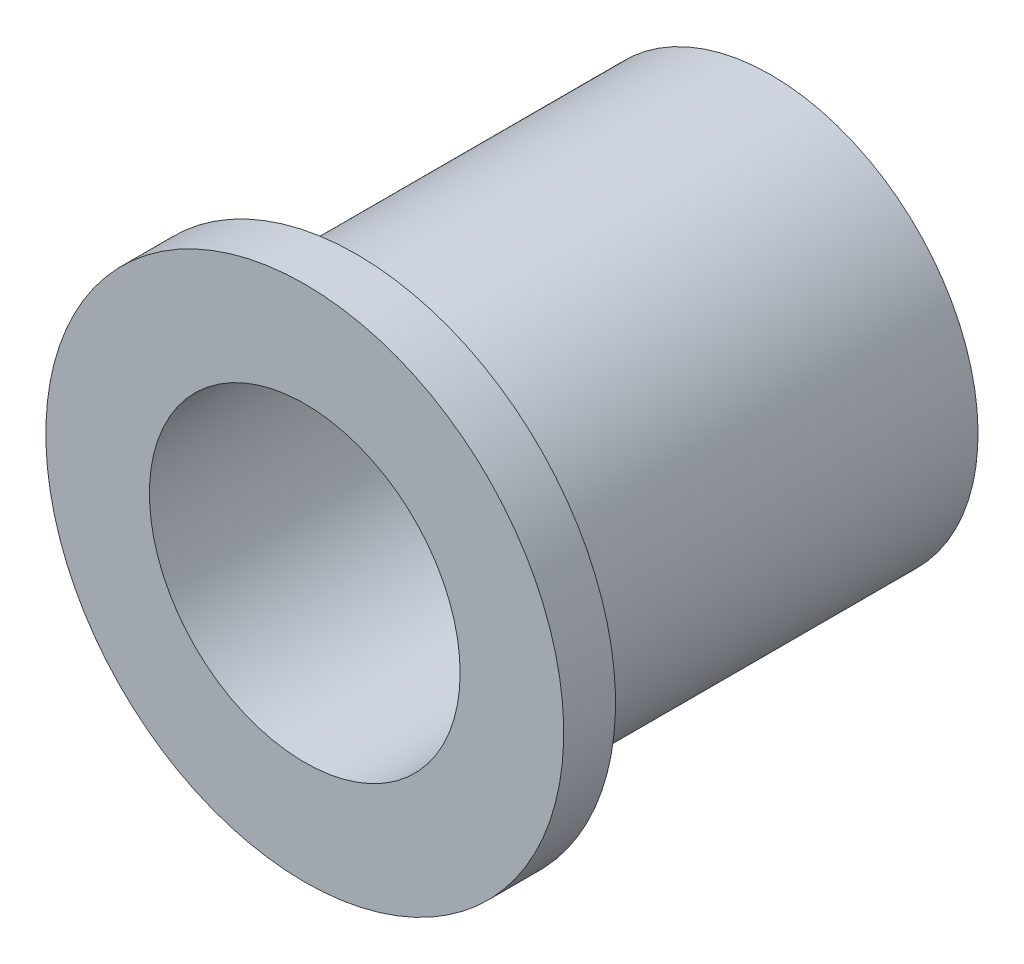
ISO-10303-21;
HEADER;
FILE_DESCRIPTION(('STEP AP214'),'2;1');
FILE_NAME('part.step','',(''),(''),'','','');
FILE_SCHEMA(('AUTOMOTIVE_DESIGN { 1 0 10303 214 1 1 1 1 }'));
ENDSEC;
DATA;
#1=APPLICATION_CONTEXT('core data for automotive mechanical design processes');
#2=APPLICATION_PROTOCOL_DEFINITION('international standard','automotive_design',2000,#1);
#3=PRODUCT_CONTEXT('',#1,'mechanical');
#4=PRODUCT('Part','Part','',(#3));
#5=PRODUCT_RELATED_PRODUCT_CATEGORY('part','',(#4));
#6=PRODUCT_DEFINITION_FORMATION('','',#4);
#7=PRODUCT_DEFINITION_CONTEXT('part definition',#1,'design');
#8=PRODUCT_DEFINITION('design','',#6,#7);
#9=PRODUCT_DEFINITION_SHAPE('','',#8);
#10=(LENGTH_UNIT() NAMED_UNIT(*) SI_UNIT(.MILLI.,.METRE.));
#11=(NAMED_UNIT(*) PLANE_ANGLE_UNIT() SI_UNIT($,.RADIAN.));
#12=(NAMED_UNIT(*) SI_UNIT($,.STERADIAN.) SOLID_ANGLE_UNIT());
#13=UNCERTAINTY_MEASURE_WITH_UNIT(LENGTH_MEASURE(1.E-05),#10,'distance_accuracy_value','');
#14=(GEOMETRIC_REPRESENTATION_CONTEXT(3) GLOBAL_UNCERTAINTY_ASSIGNED_CONTEXT((#13)) GLOBAL_UNIT_ASSIGNED_CONTEXT((#10,
#11,#12)) REPRESENTATION_CONTEXT('',''));
#15=CARTESIAN_POINT('',(0.,0.,0.));
#16=DIRECTION('',(0.,0.,1.));
#17=DIRECTION('',(1.,0.,0.));
#18=AXIS2_PLACEMENT_3D('',#15,#16,#17);
#19=CARTESIAN_POINT('',(0.,20.,-23.1706387538865));
#20=DIRECTION('',(0.,0.,-1.));
#21=DIRECTION('',(0.,1.,0.));
#22=AXIS2_PLACEMENT_3D('',#19,#20,#21);
#23=PLANE('',#22);
#24=CARTESIAN_POINT('',(0.,20.,-23.1706387538866));
#25=DIRECTION('',(0.,0.,1.));
#26=DIRECTION('',(1.,0.,0.));
#27=AXIS2_PLACEMENT_3D('',#24,#25,#26);
#28=CIRCLE('',#27,15.);
#29=CARTESIAN_POINT('',(15.,20.,-23.1706387538866));
#30=VERTEX_POINT('',#29);
#31=EDGE_CURVE('E75',#30,#30,#28,.T.);
#32=ORIENTED_EDGE('',*,*,#31,.T.);
#33=EDGE_LOOP('',(#32));
#34=FACE_BOUND('',#33,.T.);
#35=CARTESIAN_POINT('',(0.,20.,-23.1706387538866));
#36=DIRECTION('',(0.,0.,-1.));
#37=DIRECTION('',(0.,1.,0.));
#38=AXIS2_PLACEMENT_3D('',#35,#36,#37);
#39=CIRCLE('',#38,20.);
#40=CARTESIAN_POINT('',(0.,40.,-23.1706387538866));
#41=VERTEX_POINT('',#40);
#42=EDGE_CURVE('E12',#41,#41,#39,.T.);
#43=ORIENTED_EDGE('',*,*,#42,.T.);
#44=EDGE_LOOP('',(#43));
#45=FACE_BOUND('',#44,.T.);
#46=ADVANCED_FACE('F50',(#34,#45),#23,.T.);
#47=CARTESIAN_POINT('',(0.,20.,21.8293612461134));
#48=DIRECTION('',(0.,0.,-1.));
#49=DIRECTION('',(0.,1.,0.));
#50=AXIS2_PLACEMENT_3D('',#47,#48,#49);
#51=CYLINDRICAL_SURFACE('',#50,20.);
#52=CARTESIAN_POINT('',(0.,20.,16.8293612461135));
#53=DIRECTION('',(0.,0.,-1.));
#54=DIRECTION('',(0.,1.,0.));
#55=AXIS2_PLACEMENT_3D('',#52,#53,#54);
#56=CIRCLE('',#55,20.);
#57=CARTESIAN_POINT('',(0.,40.,16.8293612461135));
#58=VERTEX_POINT('',#57);
#59=EDGE_CURVE('E57',#58,#58,#56,.T.);
#60=ORIENTED_EDGE('',*,*,#59,.T.);
#61=EDGE_LOOP('',(#60));
#62=FACE_BOUND('',#61,.T.);
#63=ORIENTED_EDGE('',*,*,#42,.F.);
#64=EDGE_LOOP('',(#63));
#65=FACE_BOUND('',#64,.T.);
#66=ADVANCED_FACE('F107',(#62,#65),#51,.T.);
#67=CARTESIAN_POINT('',(0.,0.,16.8293612461134));
#68=DIRECTION('',(0.,0.,-1.));
#69=DIRECTION('',(0.,1.,0.));
#70=AXIS2_PLACEMENT_3D('',#67,#68,#69);
#71=PLANE('',#70);
#72=CARTESIAN_POINT('',(0.,20.,16.8293612461135));
#73=DIRECTION('',(0.,0.,-1.));
#74=DIRECTION('',(0.,1.,0.));
#75=AXIS2_PLACEMENT_3D('',#72,#73,#74);
#76=CIRCLE('',#75,25.);
#77=CARTESIAN_POINT('',(0.,45.,16.8293612461135));
#78=VERTEX_POINT('',#77);
#79=EDGE_CURVE('E63',#78,#78,#76,.T.);
#80=ORIENTED_EDGE('',*,*,#79,.T.);
#81=EDGE_LOOP('',(#80));
#82=FACE_BOUND('',#81,.T.);
#83=ORIENTED_EDGE('',*,*,#59,.F.);
#84=EDGE_LOOP('',(#83));
#85=FACE_BOUND('',#84,.T.);
#86=ADVANCED_FACE('F101',(#82,#85),#71,.T.);
#87=CARTESIAN_POINT('',(0.,20.,21.8293612461134));
#88=DIRECTION('',(0.,0.,-1.));
#89=DIRECTION('',(0.,1.,0.));
#90=AXIS2_PLACEMENT_3D('',#87,#88,#89);
#91=CYLINDRICAL_SURFACE('',#90,25.);
#92=CARTESIAN_POINT('',(0.,20.,21.8293612461134));
#93=DIRECTION('',(0.,0.,-1.));
#94=DIRECTION('',(0.,1.,0.));
#95=AXIS2_PLACEMENT_3D('',#92,#93,#94);
#96=CIRCLE('',#95,25.);
#97=CARTESIAN_POINT('',(0.,45.,21.8293612461135));
#98=VERTEX_POINT('',#97);
#99=EDGE_CURVE('E69',#98,#98,#96,.T.);
#100=ORIENTED_EDGE('',*,*,#99,.T.);
#101=EDGE_LOOP('',(#100));
#102=FACE_BOUND('',#101,.T.);
#103=ORIENTED_EDGE('',*,*,#79,.F.);
#104=EDGE_LOOP('',(#103));
#105=FACE_BOUND('',#104,.T.);
#106=ADVANCED_FACE('F95',(#102,#105),#91,.T.);
#107=CARTESIAN_POINT('',(0.,-5.,21.8293612461134));
#108=DIRECTION('',(0.,0.,1.));
#109=DIRECTION('',(0.,-1.,0.));
#110=AXIS2_PLACEMENT_3D('',#107,#108,#109);
#111=PLANE('',#110);
#112=CARTESIAN_POINT('',(0.,20.,21.8293612461134));
#113=DIRECTION('',(0.,0.,1.));
#114=DIRECTION('',(1.,0.,0.));
#115=AXIS2_PLACEMENT_3D('',#112,#113,#114);
#116=CIRCLE('',#115,15.);
#117=CARTESIAN_POINT('',(15.,20.,21.8293612461134));
#118=VERTEX_POINT('',#117);
#119=EDGE_CURVE('E76',#118,#118,#116,.T.);
#120=ORIENTED_EDGE('',*,*,#119,.F.);
#121=EDGE_LOOP('',(#120));
#122=FACE_BOUND('',#121,.T.);
#123=ORIENTED_EDGE('',*,*,#99,.F.);
#124=EDGE_LOOP('',(#123));
#125=FACE_BOUND('',#124,.T.);
#126=ADVANCED_FACE('F89',(#122,#125),#111,.T.);
#127=CARTESIAN_POINT('',(0.,20.,-23.1706387538866));
#128=DIRECTION('',(0.,0.,1.));
#129=DIRECTION('',(1.,0.,0.));
#130=AXIS2_PLACEMENT_3D('',#127,#128,#129);
#131=CYLINDRICAL_SURFACE('',#130,15.);
#132=CARTESIAN_POINT('',(15.,20.,-23.1706387538866));
#133=CARTESIAN_POINT('',(15.,20.,-22.7018887538866));
#134=CARTESIAN_POINT('',(15.,20.,-22.2331387538866));
#135=CARTESIAN_POINT('',(15.,20.,-21.2956387538866));
#136=CARTESIAN_POINT('',(15.,20.,-20.8268887538866));
#137=CARTESIAN_POINT('',(15.,20.,-19.8893887538866));
#138=CARTESIAN_POINT('',(15.,20.,-19.4206387538866));
#139=CARTESIAN_POINT('',(15.,20.,-18.4831387538866));
#140=CARTESIAN_POINT('',(15.,20.,-18.0143887538866));
#141=CARTESIAN_POINT('',(15.,20.,-17.0768887538866));
#142=CARTESIAN_POINT('',(15.,20.,-16.6081387538866));
#143=CARTESIAN_POINT('',(15.,20.,-15.6706387538866));
#144=CARTESIAN_POINT('',(15.,20.,-15.2018887538866));
#145=CARTESIAN_POINT('',(15.,20.,-14.2643887538866));
#146=CARTESIAN_POINT('',(15.,20.,-13.7956387538866));
#147=CARTESIAN_POINT('',(15.,20.,-12.8581387538866));
#148=CARTESIAN_POINT('',(15.,20.,-12.3893887538866));
#149=CARTESIAN_POINT('',(15.,20.,-11.4518887538866));
#150=CARTESIAN_POINT('',(15.,20.,-10.9831387538866));
#151=CARTESIAN_POINT('',(15.,20.,-10.0456387538866));
#152=CARTESIAN_POINT('',(15.,20.,-9.57688875388656));
#153=CARTESIAN_POINT('',(15.,20.,-8.63938875388656));
#154=CARTESIAN_POINT('',(15.,20.,-8.17063875388656));
#155=CARTESIAN_POINT('',(15.,20.,-7.23313875388656));
#156=CARTESIAN_POINT('',(15.,20.,-6.76438875388656));
#157=CARTESIAN_POINT('',(15.,20.,-5.82688875388656));
#158=CARTESIAN_POINT('',(15.,20.,-5.35813875388656));
#159=CARTESIAN_POINT('',(15.,20.,-4.42063875388656));
#160=CARTESIAN_POINT('',(15.,20.,-3.95188875388656));
#161=CARTESIAN_POINT('',(15.,20.,-3.01438875388656));
#162=CARTESIAN_POINT('',(15.,20.,-2.54563875388656));
#163=CARTESIAN_POINT('',(15.,20.,-1.60813875388656));
#164=CARTESIAN_POINT('',(15.,20.,-1.13938875388656));
#165=CARTESIAN_POINT('',(15.,20.,-0.201888753886562));
#166=CARTESIAN_POINT('',(15.,20.,0.266861246113439));
#167=CARTESIAN_POINT('',(15.,20.,1.20436124611344));
#168=CARTESIAN_POINT('',(15.,20.,1.67311124611344));
#169=CARTESIAN_POINT('',(15.,20.,2.61061124611344));
#170=CARTESIAN_POINT('',(15.,20.,3.07936124611344));
#171=CARTESIAN_POINT('',(15.,20.,4.01686124611344));
#172=CARTESIAN_POINT('',(15.,20.,4.48561124611344));
#173=CARTESIAN_POINT('',(15.,20.,5.42311124611344));
#174=CARTESIAN_POINT('',(15.,20.,5.89186124611344));
#175=CARTESIAN_POINT('',(15.,20.,6.82936124611344));
#176=CARTESIAN_POINT('',(15.,20.,7.29811124611344));
#177=CARTESIAN_POINT('',(15.,20.,8.23561124611344));
#178=CARTESIAN_POINT('',(15.,20.,8.70436124611344));
#179=CARTESIAN_POINT('',(15.,20.,9.64186124611344));
#180=CARTESIAN_POINT('',(15.,20.,10.1106112461134));
#181=CARTESIAN_POINT('',(15.,20.,11.0481112461134));
#182=CARTESIAN_POINT('',(15.,20.,11.5168612461134));
#183=CARTESIAN_POINT('',(15.,20.,12.4543612461134));
#184=CARTESIAN_POINT('',(15.,20.,12.9231112461134));
#185=CARTESIAN_POINT('',(15.,20.,13.8606112461134));
#186=CARTESIAN_POINT('',(15.,20.,14.3293612461134));
#187=CARTESIAN_POINT('',(15.,20.,15.2668612461134));
#188=CARTESIAN_POINT('',(15.,20.,15.7356112461134));
#189=CARTESIAN_POINT('',(15.,20.,16.6731112461134));
#190=CARTESIAN_POINT('',(15.,20.,17.1418612461134));
#191=CARTESIAN_POINT('',(15.,20.,18.0793612461134));
#192=CARTESIAN_POINT('',(15.,20.,18.5481112461134));
#193=CARTESIAN_POINT('',(15.,20.,19.4856112461134));
#194=CARTESIAN_POINT('',(15.,20.,19.9543612461134));
#195=CARTESIAN_POINT('',(15.,20.,20.8918612461134));
#196=CARTESIAN_POINT('',(15.,20.,21.3606112461134));
#197=CARTESIAN_POINT('',(15.,20.,21.8293612461134));
#198=B_SPLINE_CURVE_WITH_KNOTS('',3,(#132,#133,#134,#135,#136,#137,#138,#139,#140,#141,#142,
#143,#144,#145,#146,#147,#148,#149,#150,#151,#152,#153,#154,#155,#156,#157,#158,#159,#160,#161,
#162,#163,#164,#165,#166,#167,#168,#169,#170,#171,#172,#173,#174,#175,#176,#177,#178,#179,#180,
#181,#182,#183,#184,#185,#186,#187,#188,#189,#190,#191,#192,#193,#194,#195,#196,#197),
.UNSPECIFIED.,.F.,.F.,(4,2,2,2,2,2,2,2,2,2,2,2,2,2,2,2,2,2,2,2,2,2,2,2,2,2,2,2,2,2,2,2,4),(0.,
1.40625,2.8125,4.21875,5.625,7.03125,8.4375,9.84375,11.25,12.65625,14.0625,15.46875,16.875,
18.28125,19.6875,21.09375,22.5,23.90625,25.3125,26.71875,28.125,29.53125,30.9375,32.34375,33.75,
35.15625,36.5625,37.96875,39.375,40.78125,42.1875,43.59375,45.),.UNSPECIFIED.);
#199=EDGE_CURVE('BSEAM86',#30,#118,#198,.T.);
#200=ORIENTED_EDGE('',*,*,#31,.F.);
#201=ORIENTED_EDGE('',*,*,#119,.T.);
#202=ORIENTED_EDGE('',*,*,#199,.T.);
#203=ORIENTED_EDGE('',*,*,#199,.F.);
#204=EDGE_LOOP('',(#200,#202,#201,#203));
#205=FACE_BOUND('',#204,.T.);
#206=ADVANCED_FACE('F86',(#205),#131,.F.);
#207=CLOSED_SHELL('',(#46,#66,#86,#106,#126,#206));
#208=MANIFOLD_SOLID_BREP('B2',#207);
#209=ADVANCED_BREP_SHAPE_REPRESENTATION('',(#18,#208),#14);
#210=SHAPE_DEFINITION_REPRESENTATION(#9,#209);
ENDSEC;
END-ISO-10303-21;
